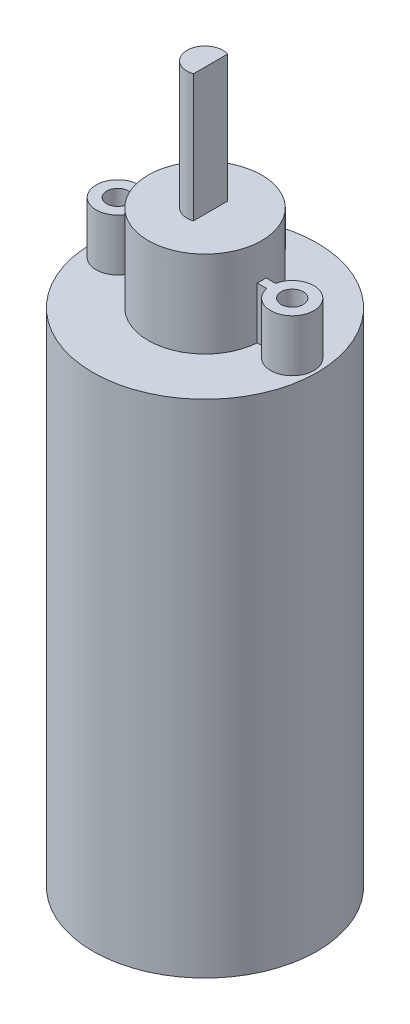
ISO-10303-21;
HEADER;
FILE_DESCRIPTION(('STEP AP214'),'2;1');
FILE_NAME('part.step','',(''),(''),'','','');
FILE_SCHEMA(('AUTOMOTIVE_DESIGN { 1 0 10303 214 1 1 1 1 }'));
ENDSEC;
DATA;
#1=APPLICATION_CONTEXT('core data for automotive mechanical design processes');
#2=APPLICATION_PROTOCOL_DEFINITION('international standard','automotive_design',2000,#1);
#3=PRODUCT_CONTEXT('',#1,'mechanical');
#4=PRODUCT('Part','Part','',(#3));
#5=PRODUCT_RELATED_PRODUCT_CATEGORY('part','',(#4));
#6=PRODUCT_DEFINITION_FORMATION('','',#4);
#7=PRODUCT_DEFINITION_CONTEXT('part definition',#1,'design');
#8=PRODUCT_DEFINITION('design','',#6,#7);
#9=PRODUCT_DEFINITION_SHAPE('','',#8);
#10=(LENGTH_UNIT() NAMED_UNIT(*) SI_UNIT(.MILLI.,.METRE.));
#11=(NAMED_UNIT(*) PLANE_ANGLE_UNIT() SI_UNIT($,.RADIAN.));
#12=(NAMED_UNIT(*) SI_UNIT($,.STERADIAN.) SOLID_ANGLE_UNIT());
#13=UNCERTAINTY_MEASURE_WITH_UNIT(LENGTH_MEASURE(1.E-05),#10,'distance_accuracy_value','');
#14=(GEOMETRIC_REPRESENTATION_CONTEXT(3) GLOBAL_UNCERTAINTY_ASSIGNED_CONTEXT((#13)) GLOBAL_UNIT_ASSIGNED_CONTEXT((#10,
#11,#12)) REPRESENTATION_CONTEXT('',''));
#15=CARTESIAN_POINT('',(0.,0.,0.));
#16=DIRECTION('',(0.,0.,1.));
#17=DIRECTION('',(1.,0.,0.));
#18=AXIS2_PLACEMENT_3D('',#15,#16,#17);
#19=CARTESIAN_POINT('',(0.,53.9115,0.));
#20=DIRECTION('',(0.,-1.,0.));
#21=DIRECTION('',(0.,0.,-1.));
#22=AXIS2_PLACEMENT_3D('',#19,#20,#21);
#23=CYLINDRICAL_SURFACE('',#22,5.207);
#24=CARTESIAN_POINT('',(0.,53.9115,0.));
#25=DIRECTION('',(0.,1.,0.));
#26=DIRECTION('',(0.,0.,1.));
#27=AXIS2_PLACEMENT_3D('',#24,#25,#26);
#28=CIRCLE('',#27,5.207);
#29=CARTESIAN_POINT('',(0.,53.9115,5.207));
#30=VERTEX_POINT('',#29);
#31=EDGE_CURVE('E127',#30,#30,#28,.T.);
#32=ORIENTED_EDGE('',*,*,#31,.F.);
#33=EDGE_LOOP('',(#32));
#34=FACE_BOUND('',#33,.T.);
#35=DIRECTION('',(0.,-1.,0.));
#36=VECTOR('',#35,1.);
#37=CARTESIAN_POINT('',(5.19122567415442,50.7365,0.405));
#38=LINE('',#37,#36);
#39=CARTESIAN_POINT('',(5.19122567415442,50.7365,0.405));
#40=VERTEX_POINT('',#39);
#41=CARTESIAN_POINT('',(5.19122567415442,45.974,0.405));
#42=VERTEX_POINT('',#41);
#43=EDGE_CURVE('E383',#40,#42,#38,.T.);
#44=ORIENTED_EDGE('',*,*,#43,.F.);
#45=CARTESIAN_POINT('',(0.,50.7365,0.));
#46=DIRECTION('',(0.,1.,0.));
#47=DIRECTION('',(0.,0.,1.));
#48=AXIS2_PLACEMENT_3D('',#45,#46,#47);
#49=CIRCLE('',#48,5.207);
#50=CARTESIAN_POINT('',(5.19122567415442,50.7365,-0.405));
#51=VERTEX_POINT('',#50);
#52=EDGE_CURVE('E57',#51,#40,#49,.F.);
#53=ORIENTED_EDGE('',*,*,#52,.F.);
#54=DIRECTION('',(0.,-1.,0.));
#55=VECTOR('',#54,1.);
#56=CARTESIAN_POINT('',(5.19122567415442,50.7365,-0.405));
#57=LINE('',#56,#55);
#58=CARTESIAN_POINT('',(5.19122567415442,45.974,-0.405));
#59=VERTEX_POINT('',#58);
#60=EDGE_CURVE('E360',#51,#59,#57,.T.);
#61=ORIENTED_EDGE('',*,*,#60,.T.);
#62=CARTESIAN_POINT('',(0.,45.974,0.));
#63=DIRECTION('',(0.,1.,0.));
#64=DIRECTION('',(0.,0.,1.));
#65=AXIS2_PLACEMENT_3D('',#62,#63,#64);
#66=CIRCLE('',#65,5.207);
#67=CARTESIAN_POINT('',(-5.19122567415442,45.974,-0.405));
#68=VERTEX_POINT('',#67);
#69=EDGE_CURVE('E141',#59,#68,#66,.T.);
#70=ORIENTED_EDGE('',*,*,#69,.T.);
#71=DIRECTION('',(0.,-1.,0.));
#72=VECTOR('',#71,1.);
#73=CARTESIAN_POINT('',(-5.19122567415442,50.7365,-0.405));
#74=LINE('',#73,#72);
#75=CARTESIAN_POINT('',(-5.19122567415442,50.7365,-0.405));
#76=VERTEX_POINT('',#75);
#77=EDGE_CURVE('E410',#76,#68,#74,.T.);
#78=ORIENTED_EDGE('',*,*,#77,.F.);
#79=CARTESIAN_POINT('',(0.,50.7365,0.));
#80=DIRECTION('',(0.,1.,0.));
#81=DIRECTION('',(0.,0.,1.));
#82=AXIS2_PLACEMENT_3D('',#79,#80,#81);
#83=CIRCLE('',#82,5.207);
#84=CARTESIAN_POINT('',(-5.19122567415442,50.7365,0.405));
#85=VERTEX_POINT('',#84);
#86=EDGE_CURVE('E394',#85,#76,#83,.F.);
#87=ORIENTED_EDGE('',*,*,#86,.F.);
#88=DIRECTION('',(0.,-1.,0.));
#89=VECTOR('',#88,1.);
#90=CARTESIAN_POINT('',(-5.19122567415442,50.7365,0.405));
#91=LINE('',#90,#89);
#92=CARTESIAN_POINT('',(-5.19122567415442,45.974,0.405));
#93=VERTEX_POINT('',#92);
#94=EDGE_CURVE('E133',#85,#93,#91,.T.);
#95=ORIENTED_EDGE('',*,*,#94,.T.);
#96=EDGE_CURVE('E137',#93,#42,#66,.T.);
#97=ORIENTED_EDGE('',*,*,#96,.T.);
#98=EDGE_LOOP('',(#44,#53,#61,#70,#78,#87,#95,#97));
#99=FACE_BOUND('',#98,.T.);
#100=ADVANCED_FACE('F34',(#34,#99),#23,.T.);
#101=CARTESIAN_POINT('',(0.,45.974,0.));
#102=DIRECTION('',(0.,-1.,0.));
#103=DIRECTION('',(0.,0.,-1.));
#104=AXIS2_PLACEMENT_3D('',#101,#102,#103);
#105=CYLINDRICAL_SURFACE('',#104,10.287);
#106=CARTESIAN_POINT('',(0.,45.974,0.));
#107=DIRECTION('',(0.,1.,0.));
#108=DIRECTION('',(0.,0.,1.));
#109=AXIS2_PLACEMENT_3D('',#106,#107,#108);
#110=CIRCLE('',#109,10.287);
#111=CARTESIAN_POINT('',(0.,45.974,10.287));
#112=VERTEX_POINT('',#111);
#113=EDGE_CURVE('E142',#112,#112,#110,.T.);
#114=ORIENTED_EDGE('',*,*,#113,.F.);
#115=EDGE_LOOP('',(#114));
#116=FACE_BOUND('',#115,.T.);
#117=CARTESIAN_POINT('',(0.,0.,0.));
#118=DIRECTION('',(0.,1.,0.));
#119=DIRECTION('',(0.,0.,1.));
#120=AXIS2_PLACEMENT_3D('',#117,#118,#119);
#121=CIRCLE('',#120,10.287);
#122=CARTESIAN_POINT('',(0.,0.,10.287));
#123=VERTEX_POINT('',#122);
#124=EDGE_CURVE('E131',#123,#123,#121,.T.);
#125=ORIENTED_EDGE('',*,*,#124,.T.);
#126=EDGE_LOOP('',(#125));
#127=FACE_BOUND('',#126,.T.);
#128=ADVANCED_FACE('F36',(#116,#127),#105,.T.);
#129=CARTESIAN_POINT('',(0.,45.974,0.));
#130=DIRECTION('',(0.,1.,0.));
#131=DIRECTION('',(0.,0.,1.));
#132=AXIS2_PLACEMENT_3D('',#129,#130,#131);
#133=PLANE('',#132);
#134=CARTESIAN_POINT('',(8.001,45.974,0.));
#135=DIRECTION('',(0.,1.,0.));
#136=DIRECTION('',(0.,0.,1.));
#137=AXIS2_PLACEMENT_3D('',#134,#135,#136);
#138=CIRCLE('',#137,1.984375);
#139=CARTESIAN_POINT('',(6.05839372475404,45.974,0.405));
#140=VERTEX_POINT('',#139);
#141=CARTESIAN_POINT('',(6.05839372475403,45.974,-0.405));
#142=VERTEX_POINT('',#141);
#143=EDGE_CURVE('E373',#140,#142,#138,.T.);
#144=ORIENTED_EDGE('',*,*,#143,.F.);
#145=DIRECTION('',(1.,0.,0.));
#146=VECTOR('',#145,1.);
#147=CARTESIAN_POINT('',(0.,45.974,0.405));
#148=LINE('',#147,#146);
#149=EDGE_CURVE('E370',#42,#140,#148,.T.);
#150=ORIENTED_EDGE('',*,*,#149,.F.);
#151=ORIENTED_EDGE('',*,*,#96,.F.);
#152=DIRECTION('',(1.,0.,0.));
#153=VECTOR('',#152,1.);
#154=CARTESIAN_POINT('',(0.,45.974,0.405));
#155=LINE('',#154,#153);
#156=CARTESIAN_POINT('',(-6.05839372475403,45.974,0.405));
#157=VERTEX_POINT('',#156);
#158=EDGE_CURVE('E405',#157,#93,#155,.T.);
#159=ORIENTED_EDGE('',*,*,#158,.F.);
#160=CARTESIAN_POINT('',(-8.001,45.974,0.));
#161=DIRECTION('',(0.,1.,0.));
#162=DIRECTION('',(0.,0.,1.));
#163=AXIS2_PLACEMENT_3D('',#160,#161,#162);
#164=CIRCLE('',#163,1.984375);
#165=CARTESIAN_POINT('',(-6.05839372475403,45.974,-0.405));
#166=VERTEX_POINT('',#165);
#167=EDGE_CURVE('E386',#166,#157,#164,.T.);
#168=ORIENTED_EDGE('',*,*,#167,.F.);
#169=DIRECTION('',(1.,0.,0.));
#170=VECTOR('',#169,1.);
#171=CARTESIAN_POINT('',(0.,45.974,-0.405));
#172=LINE('',#171,#170);
#173=EDGE_CURVE('E391',#166,#68,#172,.T.);
#174=ORIENTED_EDGE('',*,*,#173,.T.);
#175=ORIENTED_EDGE('',*,*,#69,.F.);
#176=DIRECTION('',(1.,0.,0.));
#177=VECTOR('',#176,1.);
#178=CARTESIAN_POINT('',(0.,45.974,-0.405));
#179=LINE('',#178,#177);
#180=EDGE_CURVE('E376',#59,#142,#179,.T.);
#181=ORIENTED_EDGE('',*,*,#180,.T.);
#182=EDGE_LOOP('',(#144,#150,#151,#159,#168,#174,#175,#181));
#183=FACE_BOUND('',#182,.T.);
#184=ORIENTED_EDGE('',*,*,#113,.T.);
#185=EDGE_LOOP('',(#184));
#186=FACE_BOUND('',#185,.T.);
#187=ADVANCED_FACE('F156',(#183,#186),#133,.T.);
#188=CARTESIAN_POINT('',(0.,0.,0.));
#189=DIRECTION('',(0.,1.,0.));
#190=DIRECTION('',(0.,0.,1.));
#191=AXIS2_PLACEMENT_3D('',#188,#189,#190);
#192=PLANE('',#191);
#193=ORIENTED_EDGE('',*,*,#124,.F.);
#194=EDGE_LOOP('',(#193));
#195=FACE_BOUND('',#194,.T.);
#196=ADVANCED_FACE('F169',(#195),#192,.F.);
#197=CARTESIAN_POINT('',(0.,53.9115,0.));
#198=DIRECTION('',(0.,1.,0.));
#199=DIRECTION('',(0.,0.,1.));
#200=AXIS2_PLACEMENT_3D('',#197,#198,#199);
#201=PLANE('',#200);
#202=CARTESIAN_POINT('',(0.,53.9115,0.));
#203=DIRECTION('',(0.,1.,0.));
#204=DIRECTION('',(0.,0.,1.));
#205=AXIS2_PLACEMENT_3D('',#202,#203,#204);
#206=CIRCLE('',#205,1.651);
#207=CARTESIAN_POINT('',(0.508,53.9115,-1.57090324336033));
#208=VERTEX_POINT('',#207);
#209=CARTESIAN_POINT('',(0.508,53.9115,1.57090324336033));
#210=VERTEX_POINT('',#209);
#211=EDGE_CURVE('E123',#208,#210,#206,.T.);
#212=ORIENTED_EDGE('',*,*,#211,.F.);
#213=DIRECTION('',(0.,0.,-1.));
#214=VECTOR('',#213,1.);
#215=CARTESIAN_POINT('',(0.508,53.9115,0.));
#216=LINE('',#215,#214);
#217=EDGE_CURVE('E124',#210,#208,#216,.T.);
#218=ORIENTED_EDGE('',*,*,#217,.F.);
#219=EDGE_LOOP('',(#212,#218));
#220=FACE_BOUND('',#219,.T.);
#221=ORIENTED_EDGE('',*,*,#31,.T.);
#222=EDGE_LOOP('',(#221));
#223=FACE_BOUND('',#222,.T.);
#224=ADVANCED_FACE('F182',(#220,#223),#201,.T.);
#225=CARTESIAN_POINT('',(0.,65.5955,0.));
#226=DIRECTION('',(0.,-1.,0.));
#227=DIRECTION('',(0.,0.,-1.));
#228=AXIS2_PLACEMENT_3D('',#225,#226,#227);
#229=CYLINDRICAL_SURFACE('',#228,1.651);
#230=CARTESIAN_POINT('',(0.,65.5955,0.));
#231=DIRECTION('',(0.,1.,0.));
#232=DIRECTION('',(0.,0.,1.));
#233=AXIS2_PLACEMENT_3D('',#230,#231,#232);
#234=CIRCLE('',#233,1.651);
#235=CARTESIAN_POINT('',(0.508,65.5955,-1.57090324336033));
#236=VERTEX_POINT('',#235);
#237=CARTESIAN_POINT('',(0.508,65.5955,1.57090324336033));
#238=VERTEX_POINT('',#237);
#239=EDGE_CURVE('E121',#236,#238,#234,.T.);
#240=ORIENTED_EDGE('',*,*,#239,.F.);
#241=DIRECTION('',(0.,1.,0.));
#242=VECTOR('',#241,1.);
#243=CARTESIAN_POINT('',(0.508,50.5682385684036,-1.57090324336033));
#244=LINE('',#243,#242);
#245=EDGE_CURVE('E49',#208,#236,#244,.T.);
#246=ORIENTED_EDGE('',*,*,#245,.F.);
#247=ORIENTED_EDGE('',*,*,#211,.T.);
#248=DIRECTION('',(0.,1.,0.));
#249=VECTOR('',#248,1.);
#250=CARTESIAN_POINT('',(0.508,50.5682385684036,1.57090324336033));
#251=LINE('',#250,#249);
#252=EDGE_CURVE('E112',#210,#238,#251,.T.);
#253=ORIENTED_EDGE('',*,*,#252,.T.);
#254=EDGE_LOOP('',(#240,#246,#247,#253));
#255=FACE_BOUND('',#254,.T.);
#256=ADVANCED_FACE('F120',(#255),#229,.T.);
#257=CARTESIAN_POINT('',(0.,65.5955,0.));
#258=DIRECTION('',(0.,1.,0.));
#259=DIRECTION('',(0.,0.,1.));
#260=AXIS2_PLACEMENT_3D('',#257,#258,#259);
#261=PLANE('',#260);
#262=DIRECTION('',(0.,0.,1.));
#263=VECTOR('',#262,1.);
#264=CARTESIAN_POINT('',(0.508,65.5955,0.));
#265=LINE('',#264,#263);
#266=EDGE_CURVE('E109',#236,#238,#265,.T.);
#267=ORIENTED_EDGE('',*,*,#266,.F.);
#268=ORIENTED_EDGE('',*,*,#239,.T.);
#269=EDGE_LOOP('',(#267,#268));
#270=FACE_BOUND('',#269,.T.);
#271=ADVANCED_FACE('F126',(#270),#261,.T.);
#272=CARTESIAN_POINT('',(-8.001,50.7365,0.));
#273=DIRECTION('',(0.,-1.,0.));
#274=DIRECTION('',(0.,0.,-1.));
#275=AXIS2_PLACEMENT_3D('',#272,#273,#274);
#276=CYLINDRICAL_SURFACE('',#275,1.984375);
#277=ORIENTED_EDGE('',*,*,#167,.T.);
#278=DIRECTION('',(0.,-1.,0.));
#279=VECTOR('',#278,1.);
#280=CARTESIAN_POINT('',(-6.05839372475403,50.7365,0.405));
#281=LINE('',#280,#279);
#282=CARTESIAN_POINT('',(-6.05839372475403,50.7365,0.405));
#283=VERTEX_POINT('',#282);
#284=EDGE_CURVE('E128',#283,#157,#281,.T.);
#285=ORIENTED_EDGE('',*,*,#284,.F.);
#286=CARTESIAN_POINT('',(-8.001,50.7365,0.));
#287=DIRECTION('',(0.,1.,0.));
#288=DIRECTION('',(0.,0.,1.));
#289=AXIS2_PLACEMENT_3D('',#286,#287,#288);
#290=CIRCLE('',#289,1.984375);
#291=CARTESIAN_POINT('',(-6.05839372475403,50.7365,-0.405));
#292=VERTEX_POINT('',#291);
#293=EDGE_CURVE('E387',#292,#283,#290,.T.);
#294=ORIENTED_EDGE('',*,*,#293,.F.);
#295=DIRECTION('',(0.,-1.,0.));
#296=VECTOR('',#295,1.);
#297=CARTESIAN_POINT('',(-6.05839372475403,50.7365,-0.405));
#298=LINE('',#297,#296);
#299=EDGE_CURVE('E402',#292,#166,#298,.T.);
#300=ORIENTED_EDGE('',*,*,#299,.T.);
#301=EDGE_LOOP('',(#277,#285,#294,#300));
#302=FACE_BOUND('',#301,.T.);
#303=ADVANCED_FACE('F190',(#302),#276,.T.);
#304=CARTESIAN_POINT('',(0.,50.7365,0.405));
#305=DIRECTION('',(0.,0.,-1.));
#306=DIRECTION('',(-1.,0.,0.));
#307=AXIS2_PLACEMENT_3D('',#304,#305,#306);
#308=PLANE('',#307);
#309=ORIENTED_EDGE('',*,*,#158,.T.);
#310=ORIENTED_EDGE('',*,*,#94,.F.);
#311=DIRECTION('',(1.,0.,0.));
#312=VECTOR('',#311,1.);
#313=CARTESIAN_POINT('',(0.,50.7365,0.405));
#314=LINE('',#313,#312);
#315=EDGE_CURVE('E390',#283,#85,#314,.T.);
#316=ORIENTED_EDGE('',*,*,#315,.F.);
#317=ORIENTED_EDGE('',*,*,#284,.T.);
#318=EDGE_LOOP('',(#309,#310,#316,#317));
#319=FACE_BOUND('',#318,.T.);
#320=ADVANCED_FACE('F193',(#319),#308,.F.);
#321=CARTESIAN_POINT('',(0.,50.7365,-0.405));
#322=DIRECTION('',(0.,0.,-1.));
#323=DIRECTION('',(-1.,0.,0.));
#324=AXIS2_PLACEMENT_3D('',#321,#322,#323);
#325=PLANE('',#324);
#326=ORIENTED_EDGE('',*,*,#173,.F.);
#327=ORIENTED_EDGE('',*,*,#299,.F.);
#328=DIRECTION('',(1.,0.,0.));
#329=VECTOR('',#328,1.);
#330=CARTESIAN_POINT('',(0.,50.7365,-0.405));
#331=LINE('',#330,#329);
#332=EDGE_CURVE('E396',#292,#76,#331,.T.);
#333=ORIENTED_EDGE('',*,*,#332,.T.);
#334=ORIENTED_EDGE('',*,*,#77,.T.);
#335=EDGE_LOOP('',(#326,#327,#333,#334));
#336=FACE_BOUND('',#335,.T.);
#337=ADVANCED_FACE('F197',(#336),#325,.T.);
#338=CARTESIAN_POINT('',(-8.001,50.7365,0.));
#339=DIRECTION('',(0.,-1.,0.));
#340=DIRECTION('',(0.,0.,-1.));
#341=AXIS2_PLACEMENT_3D('',#338,#339,#340);
#342=CYLINDRICAL_SURFACE('',#341,1.016);
#343=CARTESIAN_POINT('',(-8.001,50.7365,0.));
#344=DIRECTION('',(0.,1.,0.));
#345=DIRECTION('',(0.,0.,1.));
#346=AXIS2_PLACEMENT_3D('',#343,#344,#345);
#347=CIRCLE('',#346,1.016);
#348=CARTESIAN_POINT('',(-8.001,50.7365,-1.016));
#349=VERTEX_POINT('',#348);
#350=EDGE_CURVE('E399',#349,#349,#347,.T.);
#351=CARTESIAN_POINT('',(-8.001,45.974,0.));
#352=DIRECTION('',(0.,1.,0.));
#353=DIRECTION('',(0.,0.,1.));
#354=AXIS2_PLACEMENT_3D('',#351,#352,#353);
#355=CIRCLE('',#354,1.016);
#356=CARTESIAN_POINT('',(-8.001,45.974,-1.016));
#357=VERTEX_POINT('',#356);
#358=EDGE_CURVE('E42',#357,#357,#355,.F.);
#359=CARTESIAN_POINT('',(-8.001,50.7365,-1.016));
#360=CARTESIAN_POINT('',(-8.001,50.686890625,-1.016));
#361=CARTESIAN_POINT('',(-8.001,50.63728125,-1.016));
#362=CARTESIAN_POINT('',(-8.001,50.5380625,-1.016));
#363=CARTESIAN_POINT('',(-8.001,50.488453125,-1.016));
#364=CARTESIAN_POINT('',(-8.001,50.389234375,-1.016));
#365=CARTESIAN_POINT('',(-8.001,50.339625,-1.016));
#366=CARTESIAN_POINT('',(-8.001,50.24040625,-1.016));
#367=CARTESIAN_POINT('',(-8.001,50.190796875,-1.016));
#368=CARTESIAN_POINT('',(-8.001,50.091578125,-1.016));
#369=CARTESIAN_POINT('',(-8.001,50.04196875,-1.016));
#370=CARTESIAN_POINT('',(-8.001,49.94275,-1.016));
#371=CARTESIAN_POINT('',(-8.001,49.893140625,-1.016));
#372=CARTESIAN_POINT('',(-8.001,49.793921875,-1.016));
#373=CARTESIAN_POINT('',(-8.001,49.7443125,-1.016));
#374=CARTESIAN_POINT('',(-8.001,49.64509375,-1.016));
#375=CARTESIAN_POINT('',(-8.001,49.595484375,-1.016));
#376=CARTESIAN_POINT('',(-8.001,49.496265625,-1.016));
#377=CARTESIAN_POINT('',(-8.001,49.44665625,-1.016));
#378=CARTESIAN_POINT('',(-8.001,49.3474375,-1.016));
#379=CARTESIAN_POINT('',(-8.001,49.297828125,-1.016));
#380=CARTESIAN_POINT('',(-8.001,49.198609375,-1.016));
#381=CARTESIAN_POINT('',(-8.001,49.149,-1.016));
#382=CARTESIAN_POINT('',(-8.001,49.04978125,-1.016));
#383=CARTESIAN_POINT('',(-8.001,49.000171875,-1.016));
#384=CARTESIAN_POINT('',(-8.001,48.900953125,-1.016));
#385=CARTESIAN_POINT('',(-8.001,48.85134375,-1.016));
#386=CARTESIAN_POINT('',(-8.001,48.752125,-1.016));
#387=CARTESIAN_POINT('',(-8.001,48.702515625,-1.016));
#388=CARTESIAN_POINT('',(-8.001,48.603296875,-1.016));
#389=CARTESIAN_POINT('',(-8.001,48.5536875,-1.016));
#390=CARTESIAN_POINT('',(-8.001,48.45446875,-1.016));
#391=CARTESIAN_POINT('',(-8.001,48.404859375,-1.016));
#392=CARTESIAN_POINT('',(-8.001,48.305640625,-1.016));
#393=CARTESIAN_POINT('',(-8.001,48.25603125,-1.016));
#394=CARTESIAN_POINT('',(-8.001,48.1568125,-1.016));
#395=CARTESIAN_POINT('',(-8.001,48.107203125,-1.016));
#396=CARTESIAN_POINT('',(-8.001,48.007984375,-1.016));
#397=CARTESIAN_POINT('',(-8.001,47.958375,-1.016));
#398=CARTESIAN_POINT('',(-8.001,47.85915625,-1.016));
#399=CARTESIAN_POINT('',(-8.001,47.809546875,-1.016));
#400=CARTESIAN_POINT('',(-8.001,47.710328125,-1.016));
#401=CARTESIAN_POINT('',(-8.001,47.66071875,-1.016));
#402=CARTESIAN_POINT('',(-8.001,47.5615,-1.016));
#403=CARTESIAN_POINT('',(-8.001,47.511890625,-1.016));
#404=CARTESIAN_POINT('',(-8.001,47.412671875,-1.016));
#405=CARTESIAN_POINT('',(-8.001,47.3630625,-1.016));
#406=CARTESIAN_POINT('',(-8.001,47.26384375,-1.016));
#407=CARTESIAN_POINT('',(-8.001,47.214234375,-1.016));
#408=CARTESIAN_POINT('',(-8.001,47.115015625,-1.016));
#409=CARTESIAN_POINT('',(-8.001,47.06540625,-1.016));
#410=CARTESIAN_POINT('',(-8.001,46.9661875,-1.016));
#411=CARTESIAN_POINT('',(-8.001,46.916578125,-1.016));
#412=CARTESIAN_POINT('',(-8.001,46.817359375,-1.016));
#413=CARTESIAN_POINT('',(-8.001,46.76775,-1.016));
#414=CARTESIAN_POINT('',(-8.001,46.66853125,-1.016));
#415=CARTESIAN_POINT('',(-8.001,46.618921875,-1.016));
#416=CARTESIAN_POINT('',(-8.001,46.519703125,-1.016));
#417=CARTESIAN_POINT('',(-8.001,46.47009375,-1.016));
#418=CARTESIAN_POINT('',(-8.001,46.370875,-1.016));
#419=CARTESIAN_POINT('',(-8.001,46.321265625,-1.016));
#420=CARTESIAN_POINT('',(-8.001,46.222046875,-1.016));
#421=CARTESIAN_POINT('',(-8.001,46.1724375,-1.016));
#422=CARTESIAN_POINT('',(-8.001,46.07321875,-1.016));
#423=CARTESIAN_POINT('',(-8.001,46.023609375,-1.016));
#424=CARTESIAN_POINT('',(-8.001,45.974,-1.016));
#425=B_SPLINE_CURVE_WITH_KNOTS('',3,(#359,#360,#361,#362,#363,#364,#365,#366,#367,#368,#369,
#370,#371,#372,#373,#374,#375,#376,#377,#378,#379,#380,#381,#382,#383,#384,#385,#386,#387,#388,
#389,#390,#391,#392,#393,#394,#395,#396,#397,#398,#399,#400,#401,#402,#403,#404,#405,#406,#407,
#408,#409,#410,#411,#412,#413,#414,#415,#416,#417,#418,#419,#420,#421,#422,#423,#424),
.UNSPECIFIED.,.F.,.F.,(4,2,2,2,2,2,2,2,2,2,2,2,2,2,2,2,2,2,2,2,2,2,2,2,2,2,2,2,2,2,2,2,4),(0.,
0.148828125000007,0.297656250000007,0.446484375000007,0.595312500000007,0.744140625000007,
0.892968750000007,1.04179687500001,1.19062500000001,1.33945312500001,1.48828125000001,
1.63710937500001,1.78593750000001,1.93476562500001,2.08359375000001,2.23242187500001,
2.38125000000001,2.53007812500001,2.67890625000001,2.82773437500001,2.97656250000001,
3.12539062500001,3.27421875000001,3.42304687500001,3.57187500000001,3.72070312500001,
3.86953125000001,4.01835937500001,4.16718750000001,4.31601562500001,4.46484375000001,
4.61367187500001,4.76250000000001),.UNSPECIFIED.);
#426=EDGE_CURVE('BSEAM149',#349,#357,#425,.T.);
#427=ORIENTED_EDGE('',*,*,#350,.T.);
#428=ORIENTED_EDGE('',*,*,#358,.T.);
#429=ORIENTED_EDGE('',*,*,#426,.T.);
#430=ORIENTED_EDGE('',*,*,#426,.F.);
#431=EDGE_LOOP('',(#427,#429,#428,#430));
#432=FACE_BOUND('',#431,.T.);
#433=ADVANCED_FACE('F149',(#432),#342,.F.);
#434=CARTESIAN_POINT('',(0.,50.7365,0.));
#435=DIRECTION('',(0.,1.,0.));
#436=DIRECTION('',(0.,0.,1.));
#437=AXIS2_PLACEMENT_3D('',#434,#435,#436);
#438=PLANE('',#437);
#439=ORIENTED_EDGE('',*,*,#293,.T.);
#440=ORIENTED_EDGE('',*,*,#315,.T.);
#441=ORIENTED_EDGE('',*,*,#86,.T.);
#442=ORIENTED_EDGE('',*,*,#332,.F.);
#443=EDGE_LOOP('',(#439,#440,#441,#442));
#444=FACE_BOUND('',#443,.T.);
#445=ORIENTED_EDGE('',*,*,#350,.F.);
#446=EDGE_LOOP('',(#445));
#447=FACE_BOUND('',#446,.T.);
#448=ADVANCED_FACE('F154',(#444,#447),#438,.T.);
#449=ORIENTED_EDGE('',*,*,#358,.F.);
#450=EDGE_LOOP('',(#449));
#451=FACE_BOUND('',#450,.T.);
#452=ADVANCED_FACE('F151',(#451),#133,.T.);
#453=CARTESIAN_POINT('',(0.,50.7365,0.405));
#454=DIRECTION('',(0.,0.,-1.));
#455=DIRECTION('',(-1.,0.,0.));
#456=AXIS2_PLACEMENT_3D('',#453,#454,#455);
#457=PLANE('',#456);
#458=ORIENTED_EDGE('',*,*,#149,.T.);
#459=DIRECTION('',(0.,-1.,0.));
#460=VECTOR('',#459,1.);
#461=CARTESIAN_POINT('',(6.05839372475404,50.7365,0.405));
#462=LINE('',#461,#460);
#463=CARTESIAN_POINT('',(6.05839372475404,50.7365,0.405));
#464=VERTEX_POINT('',#463);
#465=EDGE_CURVE('E380',#464,#140,#462,.T.);
#466=ORIENTED_EDGE('',*,*,#465,.F.);
#467=DIRECTION('',(1.,0.,0.));
#468=VECTOR('',#467,1.);
#469=CARTESIAN_POINT('',(0.,50.7365,0.405));
#470=LINE('',#469,#468);
#471=EDGE_CURVE('E423',#40,#464,#470,.T.);
#472=ORIENTED_EDGE('',*,*,#471,.F.);
#473=ORIENTED_EDGE('',*,*,#43,.T.);
#474=EDGE_LOOP('',(#458,#466,#472,#473));
#475=FACE_BOUND('',#474,.T.);
#476=ADVANCED_FACE('F153',(#475),#457,.F.);
#477=CARTESIAN_POINT('',(8.001,50.7365,0.));
#478=DIRECTION('',(0.,-1.,0.));
#479=DIRECTION('',(0.,0.,-1.));
#480=AXIS2_PLACEMENT_3D('',#477,#478,#479);
#481=CYLINDRICAL_SURFACE('',#480,1.984375);
#482=ORIENTED_EDGE('',*,*,#143,.T.);
#483=DIRECTION('',(0.,-1.,0.));
#484=VECTOR('',#483,1.);
#485=CARTESIAN_POINT('',(6.05839372475403,50.7365,-0.405));
#486=LINE('',#485,#484);
#487=CARTESIAN_POINT('',(6.05839372475403,50.7365,-0.405));
#488=VERTEX_POINT('',#487);
#489=EDGE_CURVE('E363',#488,#142,#486,.T.);
#490=ORIENTED_EDGE('',*,*,#489,.F.);
#491=CARTESIAN_POINT('',(8.001,50.7365,0.));
#492=DIRECTION('',(0.,1.,0.));
#493=DIRECTION('',(0.,0.,1.));
#494=AXIS2_PLACEMENT_3D('',#491,#492,#493);
#495=CIRCLE('',#494,1.984375);
#496=EDGE_CURVE('E366',#464,#488,#495,.T.);
#497=ORIENTED_EDGE('',*,*,#496,.F.);
#498=ORIENTED_EDGE('',*,*,#465,.T.);
#499=EDGE_LOOP('',(#482,#490,#497,#498));
#500=FACE_BOUND('',#499,.T.);
#501=ADVANCED_FACE('F162',(#500),#481,.T.);
#502=CARTESIAN_POINT('',(0.,50.7365,-0.405));
#503=DIRECTION('',(0.,0.,-1.));
#504=DIRECTION('',(-1.,0.,0.));
#505=AXIS2_PLACEMENT_3D('',#502,#503,#504);
#506=PLANE('',#505);
#507=ORIENTED_EDGE('',*,*,#180,.F.);
#508=ORIENTED_EDGE('',*,*,#60,.F.);
#509=DIRECTION('',(1.,0.,0.));
#510=VECTOR('',#509,1.);
#511=CARTESIAN_POINT('',(0.,50.7365,-0.405));
#512=LINE('',#511,#510);
#513=EDGE_CURVE('E361',#51,#488,#512,.T.);
#514=ORIENTED_EDGE('',*,*,#513,.T.);
#515=ORIENTED_EDGE('',*,*,#489,.T.);
#516=EDGE_LOOP('',(#507,#508,#514,#515));
#517=FACE_BOUND('',#516,.T.);
#518=ADVANCED_FACE('F207',(#517),#506,.T.);
#519=CARTESIAN_POINT('',(8.001,50.7365,0.));
#520=DIRECTION('',(0.,-1.,0.));
#521=DIRECTION('',(0.,0.,-1.));
#522=AXIS2_PLACEMENT_3D('',#519,#520,#521);
#523=CYLINDRICAL_SURFACE('',#522,1.016);
#524=CARTESIAN_POINT('',(8.001,50.7365,0.));
#525=DIRECTION('',(0.,1.,0.));
#526=DIRECTION('',(0.,0.,1.));
#527=AXIS2_PLACEMENT_3D('',#524,#525,#526);
#528=CIRCLE('',#527,1.016);
#529=CARTESIAN_POINT('',(8.001,50.7365,-1.016));
#530=VERTEX_POINT('',#529);
#531=EDGE_CURVE('E359',#530,#530,#528,.T.);
#532=CARTESIAN_POINT('',(8.001,45.974,0.));
#533=DIRECTION('',(0.,1.,0.));
#534=DIRECTION('',(0.,0.,1.));
#535=AXIS2_PLACEMENT_3D('',#532,#533,#534);
#536=CIRCLE('',#535,1.016);
#537=CARTESIAN_POINT('',(8.001,45.974,-1.016));
#538=VERTEX_POINT('',#537);
#539=EDGE_CURVE('E11',#538,#538,#536,.F.);
#540=CARTESIAN_POINT('',(8.001,50.7365,-1.016));
#541=CARTESIAN_POINT('',(8.001,50.686890625,-1.016));
#542=CARTESIAN_POINT('',(8.001,50.63728125,-1.016));
#543=CARTESIAN_POINT('',(8.001,50.5380625,-1.016));
#544=CARTESIAN_POINT('',(8.001,50.488453125,-1.016));
#545=CARTESIAN_POINT('',(8.001,50.389234375,-1.016));
#546=CARTESIAN_POINT('',(8.001,50.339625,-1.016));
#547=CARTESIAN_POINT('',(8.001,50.24040625,-1.016));
#548=CARTESIAN_POINT('',(8.001,50.190796875,-1.016));
#549=CARTESIAN_POINT('',(8.001,50.091578125,-1.016));
#550=CARTESIAN_POINT('',(8.001,50.04196875,-1.016));
#551=CARTESIAN_POINT('',(8.001,49.94275,-1.016));
#552=CARTESIAN_POINT('',(8.001,49.893140625,-1.016));
#553=CARTESIAN_POINT('',(8.001,49.793921875,-1.016));
#554=CARTESIAN_POINT('',(8.001,49.7443125,-1.016));
#555=CARTESIAN_POINT('',(8.001,49.64509375,-1.016));
#556=CARTESIAN_POINT('',(8.001,49.595484375,-1.016));
#557=CARTESIAN_POINT('',(8.001,49.496265625,-1.016));
#558=CARTESIAN_POINT('',(8.001,49.44665625,-1.016));
#559=CARTESIAN_POINT('',(8.001,49.3474375,-1.016));
#560=CARTESIAN_POINT('',(8.001,49.297828125,-1.016));
#561=CARTESIAN_POINT('',(8.001,49.198609375,-1.016));
#562=CARTESIAN_POINT('',(8.001,49.149,-1.016));
#563=CARTESIAN_POINT('',(8.001,49.04978125,-1.016));
#564=CARTESIAN_POINT('',(8.001,49.000171875,-1.016));
#565=CARTESIAN_POINT('',(8.001,48.900953125,-1.016));
#566=CARTESIAN_POINT('',(8.001,48.85134375,-1.016));
#567=CARTESIAN_POINT('',(8.001,48.752125,-1.016));
#568=CARTESIAN_POINT('',(8.001,48.702515625,-1.016));
#569=CARTESIAN_POINT('',(8.001,48.603296875,-1.016));
#570=CARTESIAN_POINT('',(8.001,48.5536875,-1.016));
#571=CARTESIAN_POINT('',(8.001,48.45446875,-1.016));
#572=CARTESIAN_POINT('',(8.001,48.404859375,-1.016));
#573=CARTESIAN_POINT('',(8.001,48.305640625,-1.016));
#574=CARTESIAN_POINT('',(8.001,48.25603125,-1.016));
#575=CARTESIAN_POINT('',(8.001,48.1568125,-1.016));
#576=CARTESIAN_POINT('',(8.001,48.107203125,-1.016));
#577=CARTESIAN_POINT('',(8.001,48.007984375,-1.016));
#578=CARTESIAN_POINT('',(8.001,47.958375,-1.016));
#579=CARTESIAN_POINT('',(8.001,47.85915625,-1.016));
#580=CARTESIAN_POINT('',(8.001,47.809546875,-1.016));
#581=CARTESIAN_POINT('',(8.001,47.710328125,-1.016));
#582=CARTESIAN_POINT('',(8.001,47.66071875,-1.016));
#583=CARTESIAN_POINT('',(8.001,47.5615,-1.016));
#584=CARTESIAN_POINT('',(8.001,47.511890625,-1.016));
#585=CARTESIAN_POINT('',(8.001,47.412671875,-1.016));
#586=CARTESIAN_POINT('',(8.001,47.3630625,-1.016));
#587=CARTESIAN_POINT('',(8.001,47.26384375,-1.016));
#588=CARTESIAN_POINT('',(8.001,47.214234375,-1.016));
#589=CARTESIAN_POINT('',(8.001,47.115015625,-1.016));
#590=CARTESIAN_POINT('',(8.001,47.06540625,-1.016));
#591=CARTESIAN_POINT('',(8.001,46.9661875,-1.016));
#592=CARTESIAN_POINT('',(8.001,46.916578125,-1.016));
#593=CARTESIAN_POINT('',(8.001,46.817359375,-1.016));
#594=CARTESIAN_POINT('',(8.001,46.76775,-1.016));
#595=CARTESIAN_POINT('',(8.001,46.66853125,-1.016));
#596=CARTESIAN_POINT('',(8.001,46.618921875,-1.016));
#597=CARTESIAN_POINT('',(8.001,46.519703125,-1.016));
#598=CARTESIAN_POINT('',(8.001,46.47009375,-1.016));
#599=CARTESIAN_POINT('',(8.001,46.370875,-1.016));
#600=CARTESIAN_POINT('',(8.001,46.321265625,-1.016));
#601=CARTESIAN_POINT('',(8.001,46.222046875,-1.016));
#602=CARTESIAN_POINT('',(8.001,46.1724375,-1.016));
#603=CARTESIAN_POINT('',(8.001,46.07321875,-1.016));
#604=CARTESIAN_POINT('',(8.001,46.023609375,-1.016));
#605=CARTESIAN_POINT('',(8.001,45.974,-1.016));
#606=B_SPLINE_CURVE_WITH_KNOTS('',3,(#540,#541,#542,#543,#544,#545,#546,#547,#548,#549,#550,
#551,#552,#553,#554,#555,#556,#557,#558,#559,#560,#561,#562,#563,#564,#565,#566,#567,#568,#569,
#570,#571,#572,#573,#574,#575,#576,#577,#578,#579,#580,#581,#582,#583,#584,#585,#586,#587,#588,
#589,#590,#591,#592,#593,#594,#595,#596,#597,#598,#599,#600,#601,#602,#603,#604,#605),
.UNSPECIFIED.,.F.,.F.,(4,2,2,2,2,2,2,2,2,2,2,2,2,2,2,2,2,2,2,2,2,2,2,2,2,2,2,2,2,2,2,2,4),(0.,
0.148828125000007,0.297656250000007,0.446484375000007,0.595312500000007,0.744140625000007,
0.892968750000007,1.04179687500001,1.19062500000001,1.33945312500001,1.48828125000001,
1.63710937500001,1.78593750000001,1.93476562500001,2.08359375000001,2.23242187500001,
2.38125000000001,2.53007812500001,2.67890625000001,2.82773437500001,2.97656250000001,
3.12539062500001,3.27421875000001,3.42304687500001,3.57187500000001,3.72070312500001,
3.86953125000001,4.01835937500001,4.16718750000001,4.31601562500001,4.46484375000001,
4.61367187500001,4.76250000000001),.UNSPECIFIED.);
#607=EDGE_CURVE('BSEAM211',#530,#538,#606,.T.);
#608=ORIENTED_EDGE('',*,*,#531,.T.);
#609=ORIENTED_EDGE('',*,*,#539,.T.);
#610=ORIENTED_EDGE('',*,*,#607,.T.);
#611=ORIENTED_EDGE('',*,*,#607,.F.);
#612=EDGE_LOOP('',(#608,#610,#609,#611));
#613=FACE_BOUND('',#612,.T.);
#614=ADVANCED_FACE('F211',(#613),#523,.F.);
#615=CARTESIAN_POINT('',(0.,50.7365,0.));
#616=DIRECTION('',(0.,1.,0.));
#617=DIRECTION('',(0.,0.,1.));
#618=AXIS2_PLACEMENT_3D('',#615,#616,#617);
#619=PLANE('',#618);
#620=ORIENTED_EDGE('',*,*,#52,.T.);
#621=ORIENTED_EDGE('',*,*,#471,.T.);
#622=ORIENTED_EDGE('',*,*,#496,.T.);
#623=ORIENTED_EDGE('',*,*,#513,.F.);
#624=EDGE_LOOP('',(#620,#621,#622,#623));
#625=FACE_BOUND('',#624,.T.);
#626=ORIENTED_EDGE('',*,*,#531,.F.);
#627=EDGE_LOOP('',(#626));
#628=FACE_BOUND('',#627,.T.);
#629=ADVANCED_FACE('F172',(#625,#628),#619,.T.);
#630=ORIENTED_EDGE('',*,*,#539,.F.);
#631=EDGE_LOOP('',(#630));
#632=FACE_BOUND('',#631,.T.);
#633=ADVANCED_FACE('F157',(#632),#133,.T.);
#634=CARTESIAN_POINT('',(0.508,50.5682385684036,0.));
#635=DIRECTION('',(-1.,0.,0.));
#636=DIRECTION('',(0.,0.,1.));
#637=AXIS2_PLACEMENT_3D('',#634,#635,#636);
#638=PLANE('',#637);
#639=ORIENTED_EDGE('',*,*,#217,.T.);
#640=ORIENTED_EDGE('',*,*,#245,.T.);
#641=ORIENTED_EDGE('',*,*,#266,.T.);
#642=ORIENTED_EDGE('',*,*,#252,.F.);
#643=EDGE_LOOP('',(#639,#640,#641,#642));
#644=FACE_BOUND('',#643,.T.);
#645=ADVANCED_FACE('F111',(#644),#638,.F.);
#646=CLOSED_SHELL('',(#100,#128,#187,#196,#224,#256,#271,#303,#320,#337,#433,#448,#452,#476,
#501,#518,#614,#629,#633,#645));
#647=MANIFOLD_SOLID_BREP('B2',#646);
#648=ADVANCED_BREP_SHAPE_REPRESENTATION('',(#18,#647),#14);
#649=SHAPE_DEFINITION_REPRESENTATION(#9,#648);
ENDSEC;
END-ISO-10303-21;
